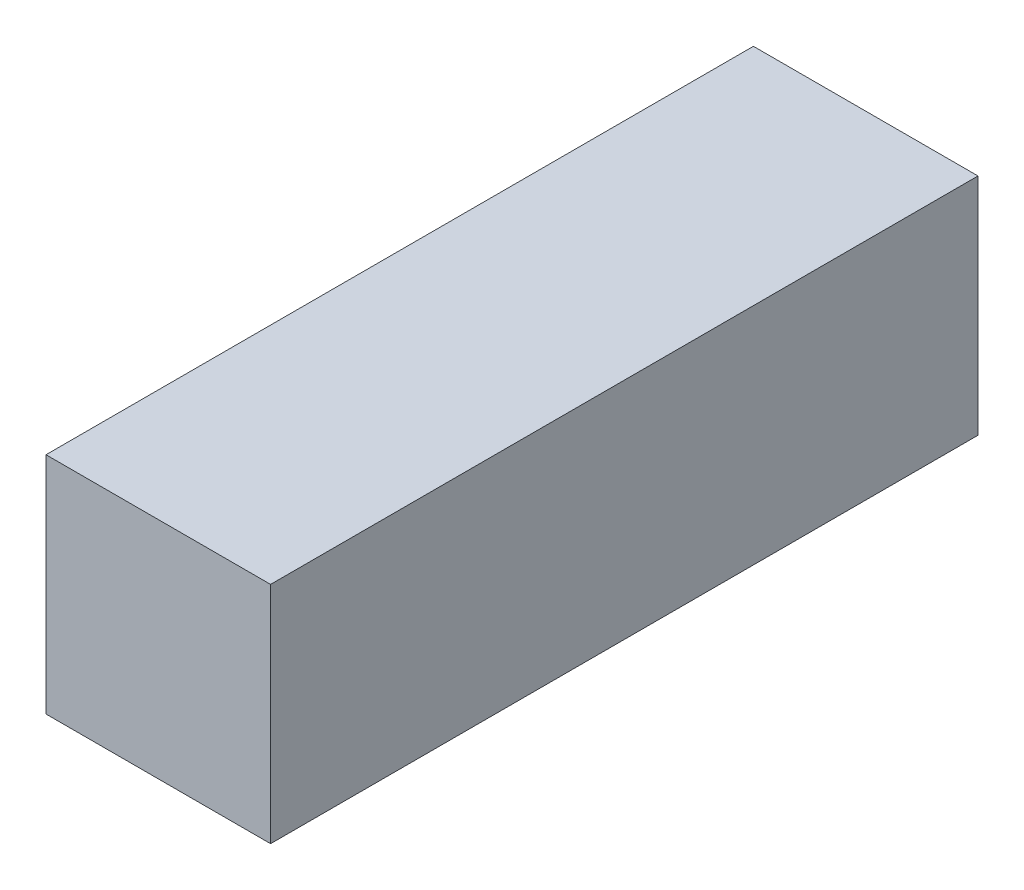
ISO-10303-21;
HEADER;
FILE_DESCRIPTION(('STEP AP214'),'2;1');
FILE_NAME('part.step','',(''),(''),'','','');
FILE_SCHEMA(('AUTOMOTIVE_DESIGN { 1 0 10303 214 1 1 1 1 }'));
ENDSEC;
DATA;
#1=APPLICATION_CONTEXT('core data for automotive mechanical design processes');
#2=APPLICATION_PROTOCOL_DEFINITION('international standard','automotive_design',2000,#1);
#3=PRODUCT_CONTEXT('',#1,'mechanical');
#4=PRODUCT('Part','Part','',(#3));
#5=PRODUCT_RELATED_PRODUCT_CATEGORY('part','',(#4));
#6=PRODUCT_DEFINITION_FORMATION('','',#4);
#7=PRODUCT_DEFINITION_CONTEXT('part definition',#1,'design');
#8=PRODUCT_DEFINITION('design','',#6,#7);
#9=PRODUCT_DEFINITION_SHAPE('','',#8);
#10=(LENGTH_UNIT() NAMED_UNIT(*) SI_UNIT(.MILLI.,.METRE.));
#11=(NAMED_UNIT(*) PLANE_ANGLE_UNIT() SI_UNIT($,.RADIAN.));
#12=(NAMED_UNIT(*) SI_UNIT($,.STERADIAN.) SOLID_ANGLE_UNIT());
#13=UNCERTAINTY_MEASURE_WITH_UNIT(LENGTH_MEASURE(1.E-05),#10,'distance_accuracy_value','');
#14=(GEOMETRIC_REPRESENTATION_CONTEXT(3) GLOBAL_UNCERTAINTY_ASSIGNED_CONTEXT((#13)) GLOBAL_UNIT_ASSIGNED_CONTEXT((#10,
#11,#12)) REPRESENTATION_CONTEXT('',''));
#15=CARTESIAN_POINT('',(0.,0.,0.));
#16=DIRECTION('',(0.,0.,1.));
#17=DIRECTION('',(1.,0.,0.));
#18=AXIS2_PLACEMENT_3D('',#15,#16,#17);
#19=CARTESIAN_POINT('',(0.,0.,32.004));
#20=DIRECTION('',(1.,0.,0.));
#21=DIRECTION('',(0.,0.,-1.));
#22=AXIS2_PLACEMENT_3D('',#19,#20,#21);
#23=PLANE('',#22);
#24=DIRECTION('',(0.,-1.,0.));
#25=VECTOR('',#24,1.);
#26=CARTESIAN_POINT('',(0.,0.,0.));
#27=LINE('',#26,#25);
#28=CARTESIAN_POINT('',(0.,10.16,0.));
#29=VERTEX_POINT('',#28);
#30=CARTESIAN_POINT('',(0.,0.,0.));
#31=VERTEX_POINT('',#30);
#32=EDGE_CURVE('E96',#29,#31,#27,.T.);
#33=ORIENTED_EDGE('',*,*,#32,.T.);
#34=DIRECTION('',(0.,0.,-1.));
#35=VECTOR('',#34,1.);
#36=CARTESIAN_POINT('',(0.,0.,32.004));
#37=LINE('',#36,#35);
#38=CARTESIAN_POINT('',(0.,0.,32.004));
#39=VERTEX_POINT('',#38);
#40=EDGE_CURVE('E11',#39,#31,#37,.T.);
#41=ORIENTED_EDGE('',*,*,#40,.F.);
#42=DIRECTION('',(0.,-1.,0.));
#43=VECTOR('',#42,1.);
#44=CARTESIAN_POINT('',(0.,0.,32.004));
#45=LINE('',#44,#43);
#46=CARTESIAN_POINT('',(0.,10.16,32.004));
#47=VERTEX_POINT('',#46);
#48=EDGE_CURVE('E84',#47,#39,#45,.T.);
#49=ORIENTED_EDGE('',*,*,#48,.F.);
#50=DIRECTION('',(0.,0.,-1.));
#51=VECTOR('',#50,1.);
#52=CARTESIAN_POINT('',(0.,10.16,32.004));
#53=LINE('',#52,#51);
#54=EDGE_CURVE('E92',#47,#29,#53,.T.);
#55=ORIENTED_EDGE('',*,*,#54,.T.);
#56=EDGE_LOOP('',(#33,#41,#49,#55));
#57=FACE_BOUND('',#56,.T.);
#58=ADVANCED_FACE('F33',(#57),#23,.F.);
#59=CARTESIAN_POINT('',(0.,0.,32.004));
#60=DIRECTION('',(0.,1.,0.));
#61=DIRECTION('',(0.,0.,1.));
#62=AXIS2_PLACEMENT_3D('',#59,#60,#61);
#63=PLANE('',#62);
#64=DIRECTION('',(1.,0.,0.));
#65=VECTOR('',#64,1.);
#66=CARTESIAN_POINT('',(0.,0.,0.));
#67=LINE('',#66,#65);
#68=CARTESIAN_POINT('',(10.16,0.,0.));
#69=VERTEX_POINT('',#68);
#70=EDGE_CURVE('E88',#31,#69,#67,.T.);
#71=ORIENTED_EDGE('',*,*,#70,.T.);
#72=DIRECTION('',(0.,0.,-1.));
#73=VECTOR('',#72,1.);
#74=CARTESIAN_POINT('',(10.16,0.,32.004));
#75=LINE('',#74,#73);
#76=CARTESIAN_POINT('',(10.16,0.,32.004));
#77=VERTEX_POINT('',#76);
#78=EDGE_CURVE('E41',#77,#69,#75,.T.);
#79=ORIENTED_EDGE('',*,*,#78,.F.);
#80=DIRECTION('',(1.,0.,0.));
#81=VECTOR('',#80,1.);
#82=CARTESIAN_POINT('',(0.,0.,32.004));
#83=LINE('',#82,#81);
#84=EDGE_CURVE('E79',#39,#77,#83,.T.);
#85=ORIENTED_EDGE('',*,*,#84,.F.);
#86=ORIENTED_EDGE('',*,*,#40,.T.);
#87=EDGE_LOOP('',(#71,#79,#85,#86));
#88=FACE_BOUND('',#87,.T.);
#89=ADVANCED_FACE('F87',(#88),#63,.F.);
#90=CARTESIAN_POINT('',(10.16,0.,32.004));
#91=DIRECTION('',(-1.,0.,0.));
#92=DIRECTION('',(0.,0.,1.));
#93=AXIS2_PLACEMENT_3D('',#90,#91,#92);
#94=PLANE('',#93);
#95=DIRECTION('',(0.,1.,0.));
#96=VECTOR('',#95,1.);
#97=CARTESIAN_POINT('',(10.16,0.,0.));
#98=LINE('',#97,#96);
#99=CARTESIAN_POINT('',(10.16,10.16,0.));
#100=VERTEX_POINT('',#99);
#101=EDGE_CURVE('E66',#69,#100,#98,.T.);
#102=ORIENTED_EDGE('',*,*,#101,.T.);
#103=DIRECTION('',(0.,0.,-1.));
#104=VECTOR('',#103,1.);
#105=CARTESIAN_POINT('',(10.16,10.16,32.004));
#106=LINE('',#105,#104);
#107=CARTESIAN_POINT('',(10.16,10.16,32.004));
#108=VERTEX_POINT('',#107);
#109=EDGE_CURVE('E89',#108,#100,#106,.T.);
#110=ORIENTED_EDGE('',*,*,#109,.F.);
#111=DIRECTION('',(0.,1.,0.));
#112=VECTOR('',#111,1.);
#113=CARTESIAN_POINT('',(10.16,0.,32.004));
#114=LINE('',#113,#112);
#115=EDGE_CURVE('E82',#77,#108,#114,.T.);
#116=ORIENTED_EDGE('',*,*,#115,.F.);
#117=ORIENTED_EDGE('',*,*,#78,.T.);
#118=EDGE_LOOP('',(#102,#110,#116,#117));
#119=FACE_BOUND('',#118,.T.);
#120=ADVANCED_FACE('F90',(#119),#94,.F.);
#121=CARTESIAN_POINT('',(0.,10.16,32.004));
#122=DIRECTION('',(0.,-1.,0.));
#123=DIRECTION('',(0.,0.,-1.));
#124=AXIS2_PLACEMENT_3D('',#121,#122,#123);
#125=PLANE('',#124);
#126=DIRECTION('',(-1.,0.,0.));
#127=VECTOR('',#126,1.);
#128=CARTESIAN_POINT('',(0.,10.16,0.));
#129=LINE('',#128,#127);
#130=EDGE_CURVE('E72',#100,#29,#129,.T.);
#131=ORIENTED_EDGE('',*,*,#130,.T.);
#132=ORIENTED_EDGE('',*,*,#54,.F.);
#133=DIRECTION('',(-1.,0.,0.));
#134=VECTOR('',#133,1.);
#135=CARTESIAN_POINT('',(0.,10.16,32.004));
#136=LINE('',#135,#134);
#137=EDGE_CURVE('E49',#108,#47,#136,.T.);
#138=ORIENTED_EDGE('',*,*,#137,.F.);
#139=ORIENTED_EDGE('',*,*,#109,.T.);
#140=EDGE_LOOP('',(#131,#132,#138,#139));
#141=FACE_BOUND('',#140,.T.);
#142=ADVANCED_FACE('F103',(#141),#125,.F.);
#143=CARTESIAN_POINT('',(0.,0.,32.004));
#144=DIRECTION('',(0.,0.,-1.));
#145=DIRECTION('',(-1.,0.,0.));
#146=AXIS2_PLACEMENT_3D('',#143,#144,#145);
#147=PLANE('',#146);
#148=ORIENTED_EDGE('',*,*,#48,.T.);
#149=ORIENTED_EDGE('',*,*,#84,.T.);
#150=ORIENTED_EDGE('',*,*,#115,.T.);
#151=ORIENTED_EDGE('',*,*,#137,.T.);
#152=EDGE_LOOP('',(#148,#149,#150,#151));
#153=FACE_BOUND('',#152,.T.);
#154=ADVANCED_FACE('F80',(#153),#147,.F.);
#155=CARTESIAN_POINT('',(0.,0.,0.));
#156=DIRECTION('',(0.,0.,-1.));
#157=DIRECTION('',(-1.,0.,0.));
#158=AXIS2_PLACEMENT_3D('',#155,#156,#157);
#159=PLANE('',#158);
#160=ORIENTED_EDGE('',*,*,#32,.F.);
#161=ORIENTED_EDGE('',*,*,#130,.F.);
#162=ORIENTED_EDGE('',*,*,#101,.F.);
#163=ORIENTED_EDGE('',*,*,#70,.F.);
#164=EDGE_LOOP('',(#160,#161,#162,#163));
#165=FACE_BOUND('',#164,.T.);
#166=ADVANCED_FACE('F106',(#165),#159,.T.);
#167=CLOSED_SHELL('',(#58,#89,#120,#142,#154,#166));
#168=MANIFOLD_SOLID_BREP('B2',#167);
#169=ADVANCED_BREP_SHAPE_REPRESENTATION('',(#18,#168),#14);
#170=SHAPE_DEFINITION_REPRESENTATION(#9,#169);
ENDSEC;
END-ISO-10303-21;
